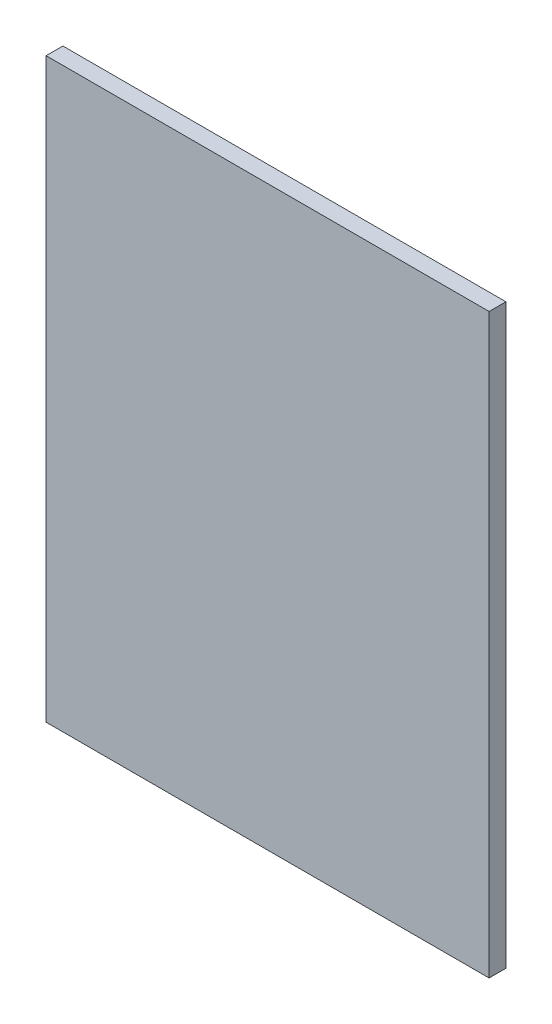
ISO-10303-21;
HEADER;
FILE_DESCRIPTION(('STEP AP214'),'2;1');
FILE_NAME('part.step','',(''),(''),'','','');
FILE_SCHEMA(('AUTOMOTIVE_DESIGN { 1 0 10303 214 1 1 1 1 }'));
ENDSEC;
DATA;
#1=APPLICATION_CONTEXT('core data for automotive mechanical design processes');
#2=APPLICATION_PROTOCOL_DEFINITION('international standard','automotive_design',2000,#1);
#3=PRODUCT_CONTEXT('',#1,'mechanical');
#4=PRODUCT('Part','Part','',(#3));
#5=PRODUCT_RELATED_PRODUCT_CATEGORY('part','',(#4));
#6=PRODUCT_DEFINITION_FORMATION('','',#4);
#7=PRODUCT_DEFINITION_CONTEXT('part definition',#1,'design');
#8=PRODUCT_DEFINITION('design','',#6,#7);
#9=PRODUCT_DEFINITION_SHAPE('','',#8);
#10=(LENGTH_UNIT() NAMED_UNIT(*) SI_UNIT(.MILLI.,.METRE.));
#11=(NAMED_UNIT(*) PLANE_ANGLE_UNIT() SI_UNIT($,.RADIAN.));
#12=(NAMED_UNIT(*) SI_UNIT($,.STERADIAN.) SOLID_ANGLE_UNIT());
#13=UNCERTAINTY_MEASURE_WITH_UNIT(LENGTH_MEASURE(1.E-05),#10,'distance_accuracy_value','');
#14=(GEOMETRIC_REPRESENTATION_CONTEXT(3) GLOBAL_UNCERTAINTY_ASSIGNED_CONTEXT((#13)) GLOBAL_UNIT_ASSIGNED_CONTEXT((#10,
#11,#12)) REPRESENTATION_CONTEXT('',''));
#15=CARTESIAN_POINT('',(0.,0.,0.));
#16=DIRECTION('',(0.,0.,1.));
#17=DIRECTION('',(1.,0.,0.));
#18=AXIS2_PLACEMENT_3D('',#15,#16,#17);
#19=CARTESIAN_POINT('',(-40.3225,-56.1975,3.175));
#20=DIRECTION('',(1.,0.,0.));
#21=DIRECTION('',(0.,0.,-1.));
#22=AXIS2_PLACEMENT_3D('',#19,#20,#21);
#23=PLANE('',#22);
#24=DIRECTION('',(0.,-1.,0.));
#25=VECTOR('',#24,1.);
#26=CARTESIAN_POINT('',(-40.3225,-56.1975,3.175));
#27=LINE('',#26,#25);
#28=CARTESIAN_POINT('',(-40.3225,53.0225,3.175));
#29=VERTEX_POINT('',#28);
#30=CARTESIAN_POINT('',(-40.3225,-56.1975,3.175));
#31=VERTEX_POINT('',#30);
#32=EDGE_CURVE('E55',#29,#31,#27,.T.);
#33=ORIENTED_EDGE('',*,*,#32,.F.);
#34=DIRECTION('',(0.,0.,1.));
#35=VECTOR('',#34,1.);
#36=CARTESIAN_POINT('',(-40.3225,53.0225,0.));
#37=LINE('',#36,#35);
#38=CARTESIAN_POINT('',(-40.3225,53.0225,0.));
#39=VERTEX_POINT('',#38);
#40=EDGE_CURVE('E87',#39,#29,#37,.T.);
#41=ORIENTED_EDGE('',*,*,#40,.F.);
#42=DIRECTION('',(0.,-1.,0.));
#43=VECTOR('',#42,1.);
#44=CARTESIAN_POINT('',(-40.3225,-56.1975,0.));
#45=LINE('',#44,#43);
#46=CARTESIAN_POINT('',(-40.3225,-56.1975,0.));
#47=VERTEX_POINT('',#46);
#48=EDGE_CURVE('E86',#39,#47,#45,.T.);
#49=ORIENTED_EDGE('',*,*,#48,.T.);
#50=DIRECTION('',(0.,0.,-1.));
#51=VECTOR('',#50,1.);
#52=CARTESIAN_POINT('',(-40.3225,-56.1975,3.175));
#53=LINE('',#52,#51);
#54=EDGE_CURVE('E11',#31,#47,#53,.T.);
#55=ORIENTED_EDGE('',*,*,#54,.F.);
#56=EDGE_LOOP('',(#33,#41,#49,#55));
#57=FACE_BOUND('',#56,.T.);
#58=ADVANCED_FACE('F33',(#57),#23,.F.);
#59=CARTESIAN_POINT('',(-40.3225,-56.1975,3.175));
#60=DIRECTION('',(0.,1.,0.));
#61=DIRECTION('',(0.,0.,1.));
#62=AXIS2_PLACEMENT_3D('',#59,#60,#61);
#63=PLANE('',#62);
#64=DIRECTION('',(1.,0.,0.));
#65=VECTOR('',#64,1.);
#66=CARTESIAN_POINT('',(-40.3225,-56.1975,0.));
#67=LINE('',#66,#65);
#68=CARTESIAN_POINT('',(43.4975,-56.1975,0.));
#69=VERTEX_POINT('',#68);
#70=EDGE_CURVE('E101',#47,#69,#67,.T.);
#71=ORIENTED_EDGE('',*,*,#70,.T.);
#72=DIRECTION('',(0.,0.,-1.));
#73=VECTOR('',#72,1.);
#74=CARTESIAN_POINT('',(43.4975,-56.1975,0.));
#75=LINE('',#74,#73);
#76=CARTESIAN_POINT('',(43.4975,-56.1975,3.175));
#77=VERTEX_POINT('',#76);
#78=EDGE_CURVE('E92',#77,#69,#75,.T.);
#79=ORIENTED_EDGE('',*,*,#78,.F.);
#80=DIRECTION('',(1.,0.,0.));
#81=VECTOR('',#80,1.);
#82=CARTESIAN_POINT('',(-40.3225,-56.1975,3.175));
#83=LINE('',#82,#81);
#84=EDGE_CURVE('E40',#31,#77,#83,.T.);
#85=ORIENTED_EDGE('',*,*,#84,.F.);
#86=ORIENTED_EDGE('',*,*,#54,.T.);
#87=EDGE_LOOP('',(#71,#79,#85,#86));
#88=FACE_BOUND('',#87,.T.);
#89=ADVANCED_FACE('F104',(#88),#63,.F.);
#90=CARTESIAN_POINT('',(40.3225,56.1975,3.175));
#91=DIRECTION('',(0.,0.,-1.));
#92=DIRECTION('',(-1.,0.,0.));
#93=AXIS2_PLACEMENT_3D('',#90,#91,#92);
#94=PLANE('',#93);
#95=DIRECTION('',(0.,-1.,0.));
#96=VECTOR('',#95,1.);
#97=CARTESIAN_POINT('',(43.4975,56.1975,3.175));
#98=LINE('',#97,#96);
#99=CARTESIAN_POINT('',(43.4975,53.0225,3.175));
#100=VERTEX_POINT('',#99);
#101=EDGE_CURVE('E93',#100,#77,#98,.T.);
#102=ORIENTED_EDGE('',*,*,#101,.F.);
#103=DIRECTION('',(1.,0.,0.));
#104=VECTOR('',#103,1.);
#105=CARTESIAN_POINT('',(43.4975,53.0225,3.175));
#106=LINE('',#105,#104);
#107=EDGE_CURVE('E47',#29,#100,#106,.T.);
#108=ORIENTED_EDGE('',*,*,#107,.F.);
#109=ORIENTED_EDGE('',*,*,#32,.T.);
#110=ORIENTED_EDGE('',*,*,#84,.T.);
#111=EDGE_LOOP('',(#102,#108,#109,#110));
#112=FACE_BOUND('',#111,.T.);
#113=ADVANCED_FACE('F107',(#112),#94,.F.);
#114=CARTESIAN_POINT('',(40.3225,56.1975,0.));
#115=DIRECTION('',(0.,0.,-1.));
#116=DIRECTION('',(-1.,0.,0.));
#117=AXIS2_PLACEMENT_3D('',#114,#115,#116);
#118=PLANE('',#117);
#119=DIRECTION('',(-1.,0.,0.));
#120=VECTOR('',#119,1.);
#121=CARTESIAN_POINT('',(43.4975,53.0225,0.));
#122=LINE('',#121,#120);
#123=CARTESIAN_POINT('',(43.4975,53.0225,0.));
#124=VERTEX_POINT('',#123);
#125=EDGE_CURVE('E74',#124,#39,#122,.T.);
#126=ORIENTED_EDGE('',*,*,#125,.F.);
#127=DIRECTION('',(0.,1.,0.));
#128=VECTOR('',#127,1.);
#129=CARTESIAN_POINT('',(43.4975,56.1975,0.));
#130=LINE('',#129,#128);
#131=EDGE_CURVE('E85',#69,#124,#130,.T.);
#132=ORIENTED_EDGE('',*,*,#131,.F.);
#133=ORIENTED_EDGE('',*,*,#70,.F.);
#134=ORIENTED_EDGE('',*,*,#48,.F.);
#135=EDGE_LOOP('',(#126,#132,#133,#134));
#136=FACE_BOUND('',#135,.T.);
#137=ADVANCED_FACE('F83',(#136),#118,.T.);
#138=CARTESIAN_POINT('',(43.4975,-56.1975,0.));
#139=DIRECTION('',(-1.,0.,0.));
#140=DIRECTION('',(0.,0.,1.));
#141=AXIS2_PLACEMENT_3D('',#138,#139,#140);
#142=PLANE('',#141);
#143=ORIENTED_EDGE('',*,*,#131,.T.);
#144=DIRECTION('',(0.,0.,-1.));
#145=VECTOR('',#144,1.);
#146=CARTESIAN_POINT('',(43.4975,53.0225,0.));
#147=LINE('',#146,#145);
#148=EDGE_CURVE('E71',#100,#124,#147,.T.);
#149=ORIENTED_EDGE('',*,*,#148,.F.);
#150=ORIENTED_EDGE('',*,*,#101,.T.);
#151=ORIENTED_EDGE('',*,*,#78,.T.);
#152=EDGE_LOOP('',(#143,#149,#150,#151));
#153=FACE_BOUND('',#152,.T.);
#154=ADVANCED_FACE('F90',(#153),#142,.F.);
#155=CARTESIAN_POINT('',(43.4975,53.0225,3.175));
#156=DIRECTION('',(0.,-1.,0.));
#157=DIRECTION('',(0.,0.,-1.));
#158=AXIS2_PLACEMENT_3D('',#155,#156,#157);
#159=PLANE('',#158);
#160=ORIENTED_EDGE('',*,*,#148,.T.);
#161=ORIENTED_EDGE('',*,*,#125,.T.);
#162=ORIENTED_EDGE('',*,*,#40,.T.);
#163=ORIENTED_EDGE('',*,*,#107,.T.);
#164=EDGE_LOOP('',(#160,#161,#162,#163));
#165=FACE_BOUND('',#164,.T.);
#166=ADVANCED_FACE('F73',(#165),#159,.F.);
#167=CLOSED_SHELL('',(#58,#89,#113,#137,#154,#166));
#168=MANIFOLD_SOLID_BREP('B2',#167);
#169=ADVANCED_BREP_SHAPE_REPRESENTATION('',(#18,#168),#14);
#170=SHAPE_DEFINITION_REPRESENTATION(#9,#169);
ENDSEC;
END-ISO-10303-21;
